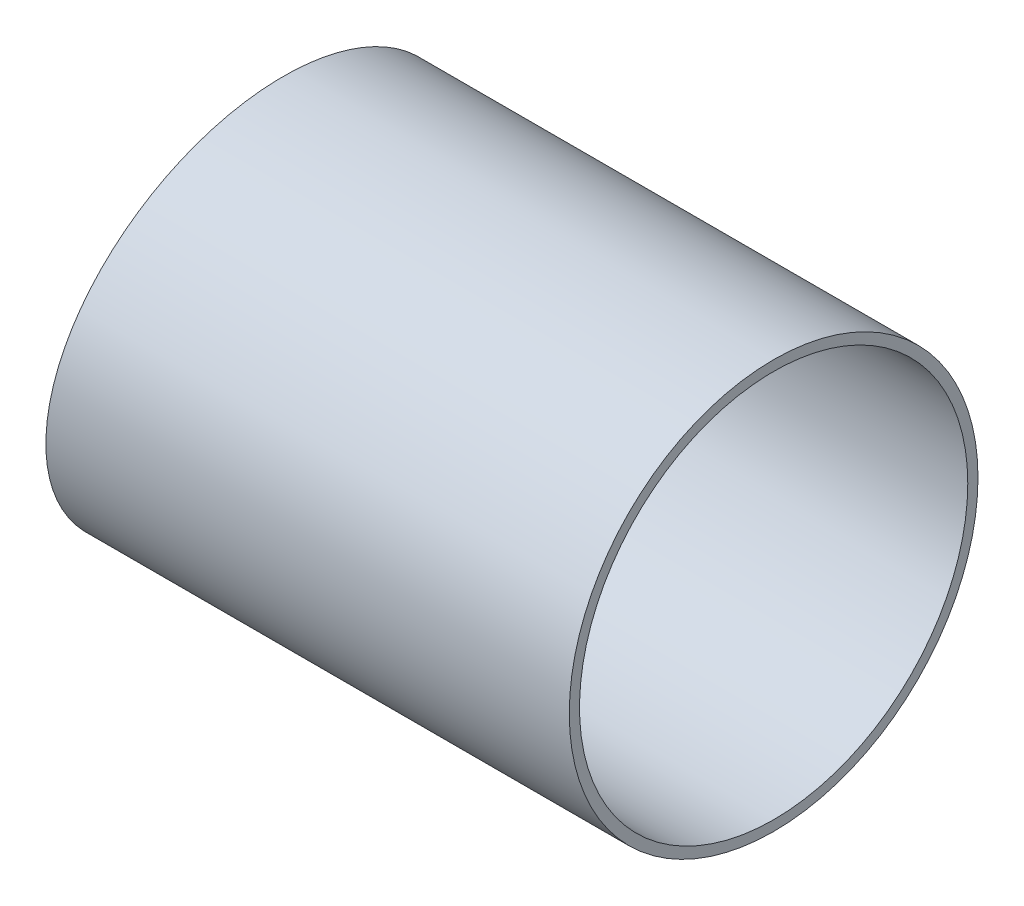
ISO-10303-21;
HEADER;
FILE_DESCRIPTION(('STEP AP214'),'2;1');
FILE_NAME('part.step','',(''),(''),'','','');
FILE_SCHEMA(('AUTOMOTIVE_DESIGN { 1 0 10303 214 1 1 1 1 }'));
ENDSEC;
DATA;
#1=APPLICATION_CONTEXT('core data for automotive mechanical design processes');
#2=APPLICATION_PROTOCOL_DEFINITION('international standard','automotive_design',2000,#1);
#3=PRODUCT_CONTEXT('',#1,'mechanical');
#4=PRODUCT('Part','Part','',(#3));
#5=PRODUCT_RELATED_PRODUCT_CATEGORY('part','',(#4));
#6=PRODUCT_DEFINITION_FORMATION('','',#4);
#7=PRODUCT_DEFINITION_CONTEXT('part definition',#1,'design');
#8=PRODUCT_DEFINITION('design','',#6,#7);
#9=PRODUCT_DEFINITION_SHAPE('','',#8);
#10=(LENGTH_UNIT() NAMED_UNIT(*) SI_UNIT(.MILLI.,.METRE.));
#11=(NAMED_UNIT(*) PLANE_ANGLE_UNIT() SI_UNIT($,.RADIAN.));
#12=(NAMED_UNIT(*) SI_UNIT($,.STERADIAN.) SOLID_ANGLE_UNIT());
#13=UNCERTAINTY_MEASURE_WITH_UNIT(LENGTH_MEASURE(1.E-05),#10,'distance_accuracy_value','');
#14=(GEOMETRIC_REPRESENTATION_CONTEXT(3) GLOBAL_UNCERTAINTY_ASSIGNED_CONTEXT((#13)) GLOBAL_UNIT_ASSIGNED_CONTEXT((#10,
#11,#12)) REPRESENTATION_CONTEXT('',''));
#15=CARTESIAN_POINT('',(0.,0.,0.));
#16=DIRECTION('',(0.,0.,1.));
#17=DIRECTION('',(1.,0.,0.));
#18=AXIS2_PLACEMENT_3D('',#15,#16,#17);
#19=CARTESIAN_POINT('',(135.,0.,0.));
#20=DIRECTION('',(1.,0.,0.));
#21=DIRECTION('',(0.,0.,-1.));
#22=AXIS2_PLACEMENT_3D('',#19,#20,#21);
#23=PLANE('',#22);
#24=CARTESIAN_POINT('',(135.,0.,0.));
#25=DIRECTION('',(1.,0.,0.));
#26=DIRECTION('',(0.,0.,-1.));
#27=AXIS2_PLACEMENT_3D('',#24,#25,#26);
#28=CIRCLE('',#27,50.);
#29=CARTESIAN_POINT('',(135.,0.,-50.));
#30=VERTEX_POINT('',#29);
#31=EDGE_CURVE('E13',#30,#30,#28,.T.);
#32=ORIENTED_EDGE('',*,*,#31,.T.);
#33=EDGE_LOOP('',(#32));
#34=FACE_BOUND('',#33,.T.);
#35=CARTESIAN_POINT('',(135.,0.,0.));
#36=DIRECTION('',(1.,0.,0.));
#37=DIRECTION('',(0.,0.,-1.));
#38=AXIS2_PLACEMENT_3D('',#35,#36,#37);
#39=CIRCLE('',#38,47.5);
#40=CARTESIAN_POINT('',(135.,0.,-47.5));
#41=VERTEX_POINT('',#40);
#42=EDGE_CURVE('E68',#41,#41,#39,.T.);
#43=ORIENTED_EDGE('',*,*,#42,.F.);
#44=EDGE_LOOP('',(#43));
#45=FACE_BOUND('',#44,.T.);
#46=ADVANCED_FACE('F59',(#34,#45),#23,.T.);
#47=CARTESIAN_POINT('',(135.,0.,0.));
#48=DIRECTION('',(-1.,0.,0.));
#49=DIRECTION('',(0.,0.,1.));
#50=AXIS2_PLACEMENT_3D('',#47,#48,#49);
#51=CYLINDRICAL_SURFACE('',#50,50.);
#52=ORIENTED_EDGE('',*,*,#31,.F.);
#53=EDGE_LOOP('',(#52));
#54=FACE_BOUND('',#53,.T.);
#55=CARTESIAN_POINT('',(7.50000000000001,0.,0.));
#56=DIRECTION('',(0.988936352868298,-0.148340452930245,0.));
#57=DIRECTION('',(-0.148340452930245,-0.988936352868298,0.));
#58=AXIS2_PLACEMENT_3D('',#55,#56,#57);
#59=ELLIPSE('',#58,50.5593710403917,50.);
#60=CARTESIAN_POINT('',(0.,-50.,0.));
#61=VERTEX_POINT('',#60);
#62=EDGE_CURVE('E75',#61,#61,#59,.T.);
#63=ORIENTED_EDGE('',*,*,#62,.T.);
#64=EDGE_LOOP('',(#63));
#65=FACE_BOUND('',#64,.T.);
#66=ADVANCED_FACE('F61',(#54,#65),#51,.T.);
#67=CARTESIAN_POINT('',(135.,0.,0.));
#68=DIRECTION('',(-1.,0.,0.));
#69=DIRECTION('',(0.,0.,1.));
#70=AXIS2_PLACEMENT_3D('',#67,#68,#69);
#71=CYLINDRICAL_SURFACE('',#70,47.5);
#72=CARTESIAN_POINT('',(7.50000000000001,0.,0.));
#73=DIRECTION('',(0.988936352868298,-0.148340452930245,0.));
#74=DIRECTION('',(-0.148340452930245,-0.988936352868298,0.));
#75=AXIS2_PLACEMENT_3D('',#72,#73,#74);
#76=ELLIPSE('',#75,48.0314024883721,47.5);
#77=CARTESIAN_POINT('',(0.375000000000008,-47.5,0.));
#78=VERTEX_POINT('',#77);
#79=EDGE_CURVE('E63',#78,#78,#76,.T.);
#80=ORIENTED_EDGE('',*,*,#79,.F.);
#81=EDGE_LOOP('',(#80));
#82=FACE_BOUND('',#81,.T.);
#83=ORIENTED_EDGE('',*,*,#42,.T.);
#84=EDGE_LOOP('',(#83));
#85=FACE_BOUND('',#84,.T.);
#86=ADVANCED_FACE('F93',(#82,#85),#71,.F.);
#87=CARTESIAN_POINT('',(15.,50.,-50.));
#88=DIRECTION('',(0.988936352868298,-0.148340452930245,0.));
#89=DIRECTION('',(0.148340452930245,0.988936352868298,0.));
#90=AXIS2_PLACEMENT_3D('',#87,#88,#89);
#91=PLANE('',#90);
#92=ORIENTED_EDGE('',*,*,#79,.T.);
#93=EDGE_LOOP('',(#92));
#94=FACE_BOUND('',#93,.T.);
#95=ORIENTED_EDGE('',*,*,#62,.F.);
#96=EDGE_LOOP('',(#95));
#97=FACE_BOUND('',#96,.T.);
#98=ADVANCED_FACE('F90',(#94,#97),#91,.F.);
#99=CLOSED_SHELL('',(#46,#66,#86,#98));
#100=MANIFOLD_SOLID_BREP('B2',#99);
#101=ADVANCED_BREP_SHAPE_REPRESENTATION('',(#18,#100),#14);
#102=SHAPE_DEFINITION_REPRESENTATION(#9,#101);
ENDSEC;
END-ISO-10303-21;
